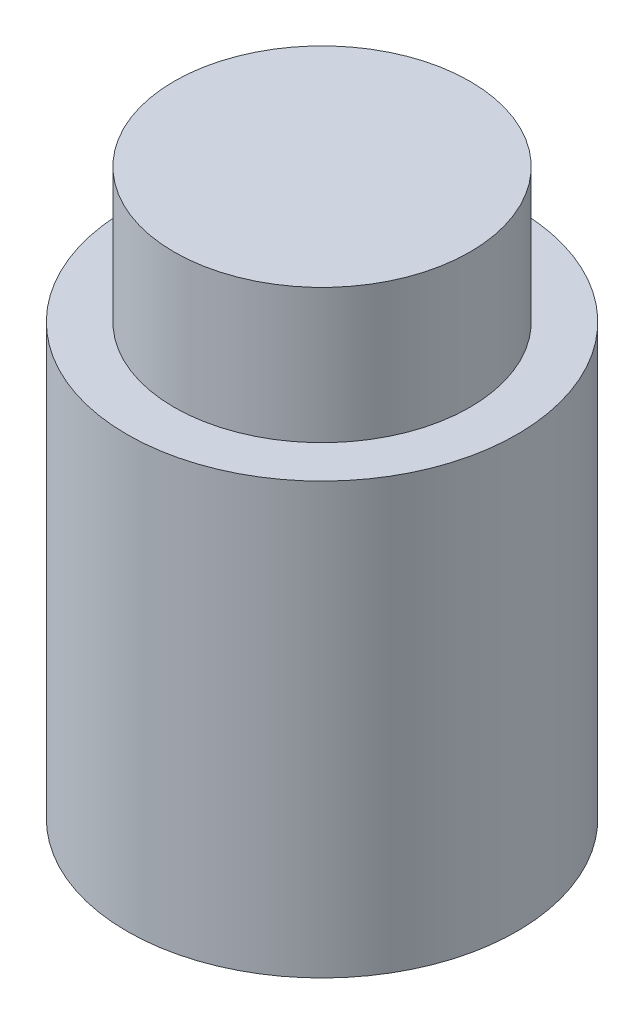
ISO-10303-21;
HEADER;
FILE_DESCRIPTION(('STEP AP214'),'2;1');
FILE_NAME('part.step','',(''),(''),'','','');
FILE_SCHEMA(('AUTOMOTIVE_DESIGN { 1 0 10303 214 1 1 1 1 }'));
ENDSEC;
DATA;
#1=APPLICATION_CONTEXT('core data for automotive mechanical design processes');
#2=APPLICATION_PROTOCOL_DEFINITION('international standard','automotive_design',2000,#1);
#3=PRODUCT_CONTEXT('',#1,'mechanical');
#4=PRODUCT('Part','Part','',(#3));
#5=PRODUCT_RELATED_PRODUCT_CATEGORY('part','',(#4));
#6=PRODUCT_DEFINITION_FORMATION('','',#4);
#7=PRODUCT_DEFINITION_CONTEXT('part definition',#1,'design');
#8=PRODUCT_DEFINITION('design','',#6,#7);
#9=PRODUCT_DEFINITION_SHAPE('','',#8);
#10=(LENGTH_UNIT() NAMED_UNIT(*) SI_UNIT(.MILLI.,.METRE.));
#11=(NAMED_UNIT(*) PLANE_ANGLE_UNIT() SI_UNIT($,.RADIAN.));
#12=(NAMED_UNIT(*) SI_UNIT($,.STERADIAN.) SOLID_ANGLE_UNIT());
#13=UNCERTAINTY_MEASURE_WITH_UNIT(LENGTH_MEASURE(1.E-05),#10,'distance_accuracy_value','');
#14=(GEOMETRIC_REPRESENTATION_CONTEXT(3) GLOBAL_UNCERTAINTY_ASSIGNED_CONTEXT((#13)) GLOBAL_UNIT_ASSIGNED_CONTEXT((#10,
#11,#12)) REPRESENTATION_CONTEXT('',''));
#15=CARTESIAN_POINT('',(0.,0.,0.));
#16=DIRECTION('',(0.,0.,1.));
#17=DIRECTION('',(1.,0.,0.));
#18=AXIS2_PLACEMENT_3D('',#15,#16,#17);
#19=CARTESIAN_POINT('',(0.,-16.,0.));
#20=DIRECTION('',(0.,1.,0.));
#21=DIRECTION('',(0.,0.,1.));
#22=AXIS2_PLACEMENT_3D('',#19,#20,#21);
#23=PLANE('',#22);
#24=CARTESIAN_POINT('',(0.,-16.,0.));
#25=DIRECTION('',(0.,-1.,0.));
#26=DIRECTION('',(0.,0.,-1.));
#27=AXIS2_PLACEMENT_3D('',#24,#25,#26);
#28=CIRCLE('',#27,3.525);
#29=CARTESIAN_POINT('',(0.,-16.,-3.525));
#30=VERTEX_POINT('',#29);
#31=EDGE_CURVE('E140',#30,#30,#28,.T.);
#32=ORIENTED_EDGE('',*,*,#31,.F.);
#33=EDGE_LOOP('',(#32));
#34=FACE_BOUND('',#33,.T.);
#35=CARTESIAN_POINT('',(0.,-16.,0.));
#36=DIRECTION('',(0.,1.,0.));
#37=DIRECTION('',(0.,0.,1.));
#38=AXIS2_PLACEMENT_3D('',#35,#36,#37);
#39=CIRCLE('',#38,7.25);
#40=CARTESIAN_POINT('',(0.,-16.,7.25));
#41=VERTEX_POINT('',#40);
#42=EDGE_CURVE('E77',#41,#41,#39,.T.);
#43=ORIENTED_EDGE('',*,*,#42,.F.);
#44=EDGE_LOOP('',(#43));
#45=FACE_BOUND('',#44,.T.);
#46=ADVANCED_FACE('F33',(#34,#45),#23,.F.);
#47=CARTESIAN_POINT('',(0.,5.,0.));
#48=DIRECTION('',(0.,-1.,0.));
#49=DIRECTION('',(0.,0.,-1.));
#50=AXIS2_PLACEMENT_3D('',#47,#48,#49);
#51=CYLINDRICAL_SURFACE('',#50,5.5);
#52=CARTESIAN_POINT('',(0.,5.,0.));
#53=DIRECTION('',(0.,1.,0.));
#54=DIRECTION('',(0.,0.,1.));
#55=AXIS2_PLACEMENT_3D('',#52,#53,#54);
#56=CIRCLE('',#55,5.5);
#57=CARTESIAN_POINT('',(0.,5.,5.5));
#58=VERTEX_POINT('',#57);
#59=EDGE_CURVE('E11',#58,#58,#56,.T.);
#60=ORIENTED_EDGE('',*,*,#59,.F.);
#61=EDGE_LOOP('',(#60));
#62=FACE_BOUND('',#61,.T.);
#63=CARTESIAN_POINT('',(0.,0.,0.));
#64=DIRECTION('',(0.,1.,0.));
#65=DIRECTION('',(0.,0.,1.));
#66=AXIS2_PLACEMENT_3D('',#63,#64,#65);
#67=CIRCLE('',#66,5.5);
#68=CARTESIAN_POINT('',(0.,0.,5.5));
#69=VERTEX_POINT('',#68);
#70=EDGE_CURVE('E42',#69,#69,#67,.T.);
#71=ORIENTED_EDGE('',*,*,#70,.T.);
#72=EDGE_LOOP('',(#71));
#73=FACE_BOUND('',#72,.T.);
#74=ADVANCED_FACE('F35',(#62,#73),#51,.T.);
#75=CARTESIAN_POINT('',(0.,5.,0.));
#76=DIRECTION('',(0.,1.,0.));
#77=DIRECTION('',(0.,0.,1.));
#78=AXIS2_PLACEMENT_3D('',#75,#76,#77);
#79=PLANE('',#78);
#80=ORIENTED_EDGE('',*,*,#59,.T.);
#81=EDGE_LOOP('',(#80));
#82=FACE_BOUND('',#81,.T.);
#83=ADVANCED_FACE('F99',(#82),#79,.T.);
#84=CARTESIAN_POINT('',(0.,-16.,0.));
#85=DIRECTION('',(0.,1.,0.));
#86=DIRECTION('',(0.,0.,1.));
#87=AXIS2_PLACEMENT_3D('',#84,#85,#86);
#88=CYLINDRICAL_SURFACE('',#87,7.25);
#89=ORIENTED_EDGE('',*,*,#42,.T.);
#90=EDGE_LOOP('',(#89));
#91=FACE_BOUND('',#90,.T.);
#92=CARTESIAN_POINT('',(0.,0.,0.));
#93=DIRECTION('',(0.,1.,0.));
#94=DIRECTION('',(0.,0.,1.));
#95=AXIS2_PLACEMENT_3D('',#92,#93,#94);
#96=CIRCLE('',#95,7.25);
#97=CARTESIAN_POINT('',(0.,0.,7.25));
#98=VERTEX_POINT('',#97);
#99=EDGE_CURVE('E74',#98,#98,#96,.T.);
#100=ORIENTED_EDGE('',*,*,#99,.F.);
#101=EDGE_LOOP('',(#100));
#102=FACE_BOUND('',#101,.T.);
#103=ADVANCED_FACE('F94',(#91,#102),#88,.T.);
#104=CARTESIAN_POINT('',(0.,0.,0.));
#105=DIRECTION('',(0.,1.,0.));
#106=DIRECTION('',(0.,0.,1.));
#107=AXIS2_PLACEMENT_3D('',#104,#105,#106);
#108=PLANE('',#107);
#109=ORIENTED_EDGE('',*,*,#70,.F.);
#110=EDGE_LOOP('',(#109));
#111=FACE_BOUND('',#110,.T.);
#112=ORIENTED_EDGE('',*,*,#99,.T.);
#113=EDGE_LOOP('',(#112));
#114=FACE_BOUND('',#113,.T.);
#115=ADVANCED_FACE('F90',(#111,#114),#108,.T.);
#116=CARTESIAN_POINT('',(0.,-11.5,0.));
#117=DIRECTION('',(0.,-1.,0.));
#118=DIRECTION('',(0.,0.,-1.));
#119=AXIS2_PLACEMENT_3D('',#116,#117,#118);
#120=PLANE('',#119);
#121=CARTESIAN_POINT('',(0.,-11.5,0.));
#122=DIRECTION('',(0.,-1.,0.));
#123=DIRECTION('',(0.,0.,-1.));
#124=AXIS2_PLACEMENT_3D('',#121,#122,#123);
#125=CIRCLE('',#124,3.525);
#126=CARTESIAN_POINT('',(0.,-11.5,-3.525));
#127=VERTEX_POINT('',#126);
#128=EDGE_CURVE('E137',#127,#127,#125,.T.);
#129=ORIENTED_EDGE('',*,*,#128,.T.);
#130=EDGE_LOOP('',(#129));
#131=FACE_BOUND('',#130,.T.);
#132=CARTESIAN_POINT('',(0.,-11.5,0.));
#133=DIRECTION('',(0.,-1.,0.));
#134=DIRECTION('',(0.,0.,-1.));
#135=AXIS2_PLACEMENT_3D('',#132,#133,#134);
#136=CIRCLE('',#135,3.025);
#137=CARTESIAN_POINT('',(0.,-11.5,-3.025));
#138=VERTEX_POINT('',#137);
#139=EDGE_CURVE('E37',#138,#138,#136,.F.);
#140=ORIENTED_EDGE('',*,*,#139,.T.);
#141=EDGE_LOOP('',(#140));
#142=FACE_BOUND('',#141,.T.);
#143=ADVANCED_FACE('F93',(#131,#142),#120,.T.);
#144=CARTESIAN_POINT('',(0.,-11.5,0.));
#145=DIRECTION('',(0.,-1.,0.));
#146=DIRECTION('',(0.,0.,-1.));
#147=AXIS2_PLACEMENT_3D('',#144,#145,#146);
#148=CYLINDRICAL_SURFACE('',#147,3.525);
#149=ORIENTED_EDGE('',*,*,#128,.F.);
#150=EDGE_LOOP('',(#149));
#151=FACE_BOUND('',#150,.T.);
#152=ORIENTED_EDGE('',*,*,#31,.T.);
#153=EDGE_LOOP('',(#152));
#154=FACE_BOUND('',#153,.T.);
#155=ADVANCED_FACE('F123',(#151,#154),#148,.F.);
#156=CARTESIAN_POINT('',(0.,-2.5,0.));
#157=DIRECTION('',(0.,-1.,0.));
#158=DIRECTION('',(0.,0.,-1.));
#159=AXIS2_PLACEMENT_3D('',#156,#157,#158);
#160=PLANE('',#159);
#161=DIRECTION('',(1.,0.,0.));
#162=VECTOR('',#161,1.);
#163=CARTESIAN_POINT('',(0.,-2.5,1.5));
#164=LINE('',#163,#162);
#165=CARTESIAN_POINT('',(-2.62690407133569,-2.5,1.5));
#166=VERTEX_POINT('',#165);
#167=CARTESIAN_POINT('',(2.62690407133569,-2.5,1.5));
#168=VERTEX_POINT('',#167);
#169=EDGE_CURVE('E56',#166,#168,#164,.T.);
#170=ORIENTED_EDGE('',*,*,#169,.F.);
#171=CARTESIAN_POINT('',(0.,-2.5,0.));
#172=DIRECTION('',(0.,-1.,0.));
#173=DIRECTION('',(0.,0.,-1.));
#174=AXIS2_PLACEMENT_3D('',#171,#172,#173);
#175=CIRCLE('',#174,3.025);
#176=EDGE_CURVE('E79',#166,#168,#175,.T.);
#177=ORIENTED_EDGE('',*,*,#176,.T.);
#178=EDGE_LOOP('',(#170,#177));
#179=FACE_BOUND('',#178,.T.);
#180=ADVANCED_FACE('F118',(#179),#160,.T.);
#181=CARTESIAN_POINT('',(0.,-2.5,1.5));
#182=DIRECTION('',(0.,0.,-1.));
#183=DIRECTION('',(-1.,0.,0.));
#184=AXIS2_PLACEMENT_3D('',#181,#182,#183);
#185=PLANE('',#184);
#186=DIRECTION('',(0.,-1.,0.));
#187=VECTOR('',#186,1.);
#188=CARTESIAN_POINT('',(2.62690407133569,-2.5,1.5));
#189=LINE('',#188,#187);
#190=CARTESIAN_POINT('',(2.62690407133569,-9.5,1.5));
#191=VERTEX_POINT('',#190);
#192=EDGE_CURVE('E69',#168,#191,#189,.T.);
#193=ORIENTED_EDGE('',*,*,#192,.T.);
#194=DIRECTION('',(-1.,0.,0.));
#195=VECTOR('',#194,1.);
#196=CARTESIAN_POINT('',(0.,-9.5,1.5));
#197=LINE('',#196,#195);
#198=CARTESIAN_POINT('',(-2.62690407133569,-9.5,1.5));
#199=VERTEX_POINT('',#198);
#200=EDGE_CURVE('E61',#191,#199,#197,.T.);
#201=ORIENTED_EDGE('',*,*,#200,.T.);
#202=DIRECTION('',(0.,-1.,0.));
#203=VECTOR('',#202,1.);
#204=CARTESIAN_POINT('',(-2.62690407133569,-2.5,1.5));
#205=LINE('',#204,#203);
#206=EDGE_CURVE('E71',#166,#199,#205,.T.);
#207=ORIENTED_EDGE('',*,*,#206,.F.);
#208=ORIENTED_EDGE('',*,*,#169,.T.);
#209=EDGE_LOOP('',(#193,#201,#207,#208));
#210=FACE_BOUND('',#209,.T.);
#211=ADVANCED_FACE('F73',(#210),#185,.T.);
#212=CARTESIAN_POINT('',(0.,-9.5,0.));
#213=DIRECTION('',(0.,-1.,0.));
#214=DIRECTION('',(0.,0.,-1.));
#215=AXIS2_PLACEMENT_3D('',#212,#213,#214);
#216=PLANE('',#215);
#217=CARTESIAN_POINT('',(0.,-9.5,0.));
#218=DIRECTION('',(0.,-1.,0.));
#219=DIRECTION('',(0.,0.,-1.));
#220=AXIS2_PLACEMENT_3D('',#217,#218,#219);
#221=CIRCLE('',#220,3.025);
#222=EDGE_CURVE('E48',#191,#199,#221,.T.);
#223=ORIENTED_EDGE('',*,*,#222,.T.);
#224=ORIENTED_EDGE('',*,*,#200,.F.);
#225=EDGE_LOOP('',(#223,#224));
#226=FACE_BOUND('',#225,.T.);
#227=ADVANCED_FACE('F62',(#226),#216,.T.);
#228=CARTESIAN_POINT('',(0.,-2.5,0.));
#229=DIRECTION('',(0.,-1.,0.));
#230=DIRECTION('',(0.,0.,-1.));
#231=AXIS2_PLACEMENT_3D('',#228,#229,#230);
#232=CYLINDRICAL_SURFACE('',#231,3.025);
#233=ORIENTED_EDGE('',*,*,#222,.F.);
#234=ORIENTED_EDGE('',*,*,#192,.F.);
#235=ORIENTED_EDGE('',*,*,#176,.F.);
#236=ORIENTED_EDGE('',*,*,#206,.T.);
#237=EDGE_LOOP('',(#233,#234,#235,#236));
#238=FACE_BOUND('',#237,.T.);
#239=ORIENTED_EDGE('',*,*,#139,.F.);
#240=EDGE_LOOP('',(#239));
#241=FACE_BOUND('',#240,.T.);
#242=ADVANCED_FACE('F66',(#238,#241),#232,.F.);
#243=CLOSED_SHELL('',(#46,#74,#83,#103,#115,#143,#155,#180,#211,#227,#242));
#244=MANIFOLD_SOLID_BREP('B2',#243);
#245=ADVANCED_BREP_SHAPE_REPRESENTATION('',(#18,#244),#14);
#246=SHAPE_DEFINITION_REPRESENTATION(#9,#245);
ENDSEC;
END-ISO-10303-21;
